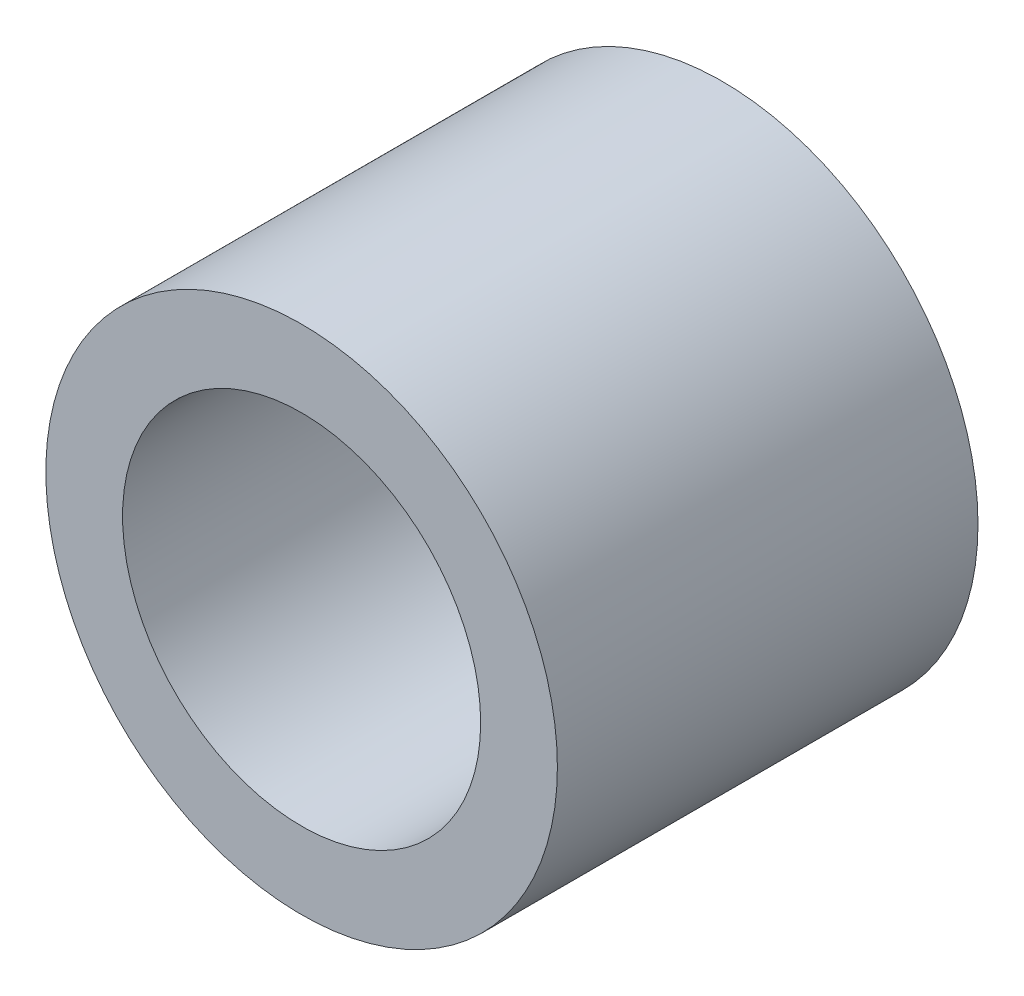
ISO-10303-21;
HEADER;
FILE_DESCRIPTION(('STEP AP214'),'2;1');
FILE_NAME('part.step','',(''),(''),'','','');
FILE_SCHEMA(('AUTOMOTIVE_DESIGN { 1 0 10303 214 1 1 1 1 }'));
ENDSEC;
DATA;
#1=APPLICATION_CONTEXT('core data for automotive mechanical design processes');
#2=APPLICATION_PROTOCOL_DEFINITION('international standard','automotive_design',2000,#1);
#3=PRODUCT_CONTEXT('',#1,'mechanical');
#4=PRODUCT('Part','Part','',(#3));
#5=PRODUCT_RELATED_PRODUCT_CATEGORY('part','',(#4));
#6=PRODUCT_DEFINITION_FORMATION('','',#4);
#7=PRODUCT_DEFINITION_CONTEXT('part definition',#1,'design');
#8=PRODUCT_DEFINITION('design','',#6,#7);
#9=PRODUCT_DEFINITION_SHAPE('','',#8);
#10=(LENGTH_UNIT() NAMED_UNIT(*) SI_UNIT(.MILLI.,.METRE.));
#11=(NAMED_UNIT(*) PLANE_ANGLE_UNIT() SI_UNIT($,.RADIAN.));
#12=(NAMED_UNIT(*) SI_UNIT($,.STERADIAN.) SOLID_ANGLE_UNIT());
#13=UNCERTAINTY_MEASURE_WITH_UNIT(LENGTH_MEASURE(1.E-05),#10,'distance_accuracy_value','');
#14=(GEOMETRIC_REPRESENTATION_CONTEXT(3) GLOBAL_UNCERTAINTY_ASSIGNED_CONTEXT((#13)) GLOBAL_UNIT_ASSIGNED_CONTEXT((#10,
#11,#12)) REPRESENTATION_CONTEXT('',''));
#15=CARTESIAN_POINT('',(0.,0.,0.));
#16=DIRECTION('',(0.,0.,1.));
#17=DIRECTION('',(1.,0.,0.));
#18=AXIS2_PLACEMENT_3D('',#15,#16,#17);
#19=CARTESIAN_POINT('',(0.,0.,7.4));
#20=DIRECTION('',(0.,0.,1.));
#21=DIRECTION('',(1.,0.,0.));
#22=AXIS2_PLACEMENT_3D('',#19,#20,#21);
#23=PLANE('',#22);
#24=CARTESIAN_POINT('',(0.,0.,7.4));
#25=DIRECTION('',(0.,0.,1.));
#26=DIRECTION('',(1.,0.,0.));
#27=AXIS2_PLACEMENT_3D('',#24,#25,#26);
#28=CIRCLE('',#27,4.5);
#29=CARTESIAN_POINT('',(4.5,0.,7.4));
#30=VERTEX_POINT('',#29);
#31=EDGE_CURVE('E10',#30,#30,#28,.T.);
#32=ORIENTED_EDGE('',*,*,#31,.T.);
#33=EDGE_LOOP('',(#32));
#34=FACE_BOUND('',#33,.T.);
#35=CARTESIAN_POINT('',(0.,0.,7.4));
#36=DIRECTION('',(0.,0.,1.));
#37=DIRECTION('',(1.,0.,0.));
#38=AXIS2_PLACEMENT_3D('',#35,#36,#37);
#39=CIRCLE('',#38,3.15);
#40=CARTESIAN_POINT('',(3.15,0.,7.4));
#41=VERTEX_POINT('',#40);
#42=EDGE_CURVE('E57',#41,#41,#39,.T.);
#43=ORIENTED_EDGE('',*,*,#42,.F.);
#44=EDGE_LOOP('',(#43));
#45=FACE_BOUND('',#44,.T.);
#46=ADVANCED_FACE('F43',(#34,#45),#23,.T.);
#47=CARTESIAN_POINT('',(0.,0.,0.));
#48=DIRECTION('',(0.,0.,1.));
#49=DIRECTION('',(1.,0.,0.));
#50=AXIS2_PLACEMENT_3D('',#47,#48,#49);
#51=PLANE('',#50);
#52=CARTESIAN_POINT('',(0.,0.,0.));
#53=DIRECTION('',(0.,0.,1.));
#54=DIRECTION('',(1.,0.,0.));
#55=AXIS2_PLACEMENT_3D('',#52,#53,#54);
#56=CIRCLE('',#55,4.5);
#57=CARTESIAN_POINT('',(4.5,0.,0.));
#58=VERTEX_POINT('',#57);
#59=EDGE_CURVE('E50',#58,#58,#56,.T.);
#60=ORIENTED_EDGE('',*,*,#59,.F.);
#61=EDGE_LOOP('',(#60));
#62=FACE_BOUND('',#61,.T.);
#63=CARTESIAN_POINT('',(0.,0.,0.));
#64=DIRECTION('',(0.,0.,1.));
#65=DIRECTION('',(1.,0.,0.));
#66=AXIS2_PLACEMENT_3D('',#63,#64,#65);
#67=CIRCLE('',#66,3.15);
#68=CARTESIAN_POINT('',(3.15,0.,0.));
#69=VERTEX_POINT('',#68);
#70=EDGE_CURVE('E59',#69,#69,#67,.T.);
#71=ORIENTED_EDGE('',*,*,#70,.T.);
#72=EDGE_LOOP('',(#71));
#73=FACE_BOUND('',#72,.T.);
#74=ADVANCED_FACE('F68',(#62,#73),#51,.F.);
#75=CARTESIAN_POINT('',(0.,0.,7.4));
#76=DIRECTION('',(0.,0.,-1.));
#77=DIRECTION('',(-1.,0.,0.));
#78=AXIS2_PLACEMENT_3D('',#75,#76,#77);
#79=CYLINDRICAL_SURFACE('',#78,4.5);
#80=ORIENTED_EDGE('',*,*,#31,.F.);
#81=EDGE_LOOP('',(#80));
#82=FACE_BOUND('',#81,.T.);
#83=ORIENTED_EDGE('',*,*,#59,.T.);
#84=EDGE_LOOP('',(#83));
#85=FACE_BOUND('',#84,.T.);
#86=ADVANCED_FACE('F44',(#82,#85),#79,.T.);
#87=CARTESIAN_POINT('',(0.,0.,7.4));
#88=DIRECTION('',(0.,0.,-1.));
#89=DIRECTION('',(-1.,0.,0.));
#90=AXIS2_PLACEMENT_3D('',#87,#88,#89);
#91=CYLINDRICAL_SURFACE('',#90,3.15);
#92=ORIENTED_EDGE('',*,*,#42,.T.);
#93=EDGE_LOOP('',(#92));
#94=FACE_BOUND('',#93,.T.);
#95=ORIENTED_EDGE('',*,*,#70,.F.);
#96=EDGE_LOOP('',(#95));
#97=FACE_BOUND('',#96,.T.);
#98=ADVANCED_FACE('F67',(#94,#97),#91,.F.);
#99=CLOSED_SHELL('',(#46,#74,#86,#98));
#100=MANIFOLD_SOLID_BREP('B2',#99);
#101=ADVANCED_BREP_SHAPE_REPRESENTATION('',(#18,#100),#14);
#102=SHAPE_DEFINITION_REPRESENTATION(#9,#101);
ENDSEC;
END-ISO-10303-21;
